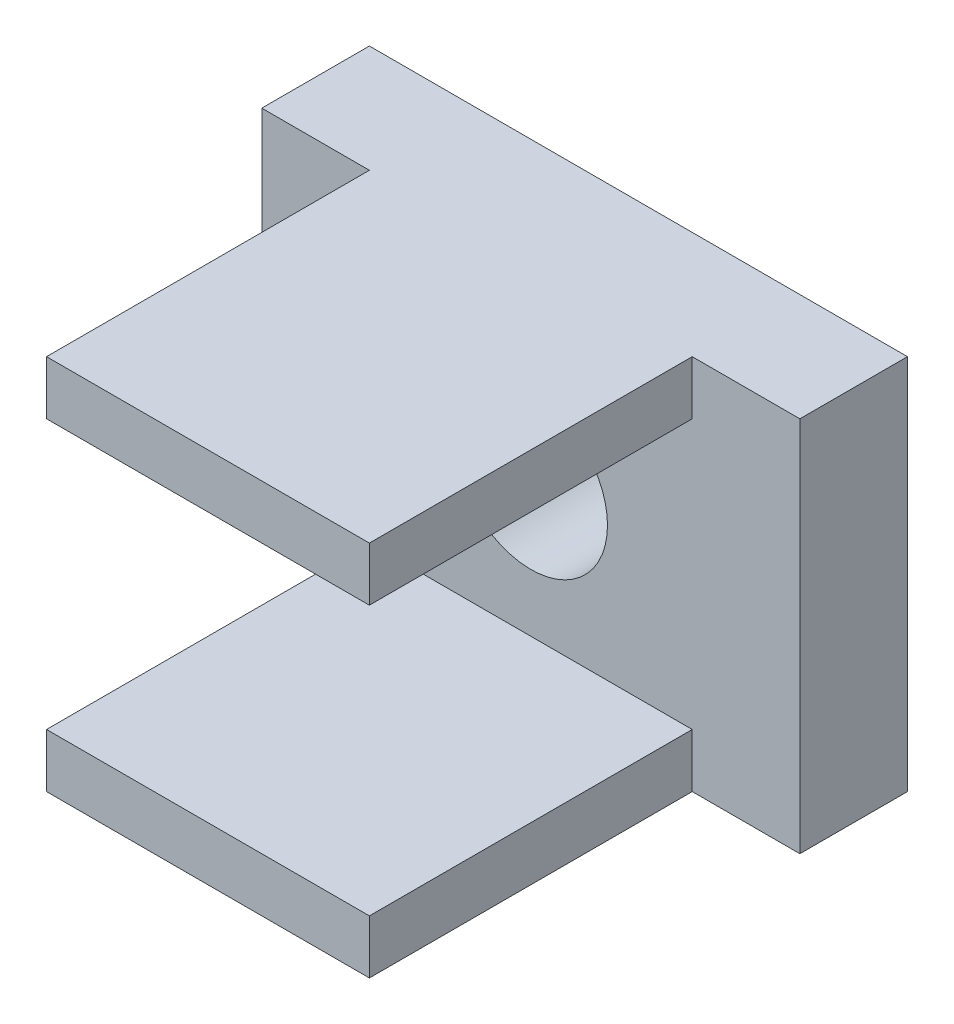
ISO-10303-21;
HEADER;
FILE_DESCRIPTION(('STEP AP214'),'2;1');
FILE_NAME('part.step','',(''),(''),'','','');
FILE_SCHEMA(('AUTOMOTIVE_DESIGN { 1 0 10303 214 1 1 1 1 }'));
ENDSEC;
DATA;
#1=APPLICATION_CONTEXT('core data for automotive mechanical design processes');
#2=APPLICATION_PROTOCOL_DEFINITION('international standard','automotive_design',2000,#1);
#3=PRODUCT_CONTEXT('',#1,'mechanical');
#4=PRODUCT('Part','Part','',(#3));
#5=PRODUCT_RELATED_PRODUCT_CATEGORY('part','',(#4));
#6=PRODUCT_DEFINITION_FORMATION('','',#4);
#7=PRODUCT_DEFINITION_CONTEXT('part definition',#1,'design');
#8=PRODUCT_DEFINITION('design','',#6,#7);
#9=PRODUCT_DEFINITION_SHAPE('','',#8);
#10=(LENGTH_UNIT() NAMED_UNIT(*) SI_UNIT(.MILLI.,.METRE.));
#11=(NAMED_UNIT(*) PLANE_ANGLE_UNIT() SI_UNIT($,.RADIAN.));
#12=(NAMED_UNIT(*) SI_UNIT($,.STERADIAN.) SOLID_ANGLE_UNIT());
#13=UNCERTAINTY_MEASURE_WITH_UNIT(LENGTH_MEASURE(1.E-05),#10,'distance_accuracy_value','');
#14=(GEOMETRIC_REPRESENTATION_CONTEXT(3) GLOBAL_UNCERTAINTY_ASSIGNED_CONTEXT((#13)) GLOBAL_UNIT_ASSIGNED_CONTEXT((#10,
#11,#12)) REPRESENTATION_CONTEXT('',''));
#15=CARTESIAN_POINT('',(0.,0.,0.));
#16=DIRECTION('',(0.,0.,1.));
#17=DIRECTION('',(1.,0.,0.));
#18=AXIS2_PLACEMENT_3D('',#15,#16,#17);
#19=CARTESIAN_POINT('',(0.,0.,1.));
#20=DIRECTION('',(0.,0.,-1.));
#21=DIRECTION('',(-1.,0.,0.));
#22=AXIS2_PLACEMENT_3D('',#19,#20,#21);
#23=PLANE('',#22);
#24=CARTESIAN_POINT('',(0.,0.,1.));
#25=DIRECTION('',(0.,0.,1.));
#26=DIRECTION('',(1.,0.,0.));
#27=AXIS2_PLACEMENT_3D('',#24,#25,#26);
#28=CIRCLE('',#27,1.425);
#29=CARTESIAN_POINT('',(1.425,0.,1.));
#30=VERTEX_POINT('',#29);
#31=EDGE_CURVE('E427',#30,#30,#28,.T.);
#32=ORIENTED_EDGE('',*,*,#31,.F.);
#33=EDGE_LOOP('',(#32));
#34=FACE_BOUND('',#33,.T.);
#35=DIRECTION('',(1.,0.,0.));
#36=VECTOR('',#35,1.);
#37=CARTESIAN_POINT('',(-3.,-2.5,1.));
#38=LINE('',#37,#36);
#39=CARTESIAN_POINT('',(-3.,-2.5,1.));
#40=VERTEX_POINT('',#39);
#41=CARTESIAN_POINT('',(3.,-2.5,1.));
#42=VERTEX_POINT('',#41);
#43=EDGE_CURVE('E55',#40,#42,#38,.T.);
#44=ORIENTED_EDGE('',*,*,#43,.T.);
#45=DIRECTION('',(0.,-1.,0.));
#46=VECTOR('',#45,1.);
#47=CARTESIAN_POINT('',(3.,-2.5,1.));
#48=LINE('',#47,#46);
#49=CARTESIAN_POINT('',(3.,-3.5,1.));
#50=VERTEX_POINT('',#49);
#51=EDGE_CURVE('E135',#42,#50,#48,.T.);
#52=ORIENTED_EDGE('',*,*,#51,.T.);
#53=DIRECTION('',(1.,0.,0.));
#54=VECTOR('',#53,1.);
#55=CARTESIAN_POINT('',(-5.,-3.5,1.));
#56=LINE('',#55,#54);
#57=CARTESIAN_POINT('',(5.,-3.5,1.));
#58=VERTEX_POINT('',#57);
#59=EDGE_CURVE('E231',#50,#58,#56,.T.);
#60=ORIENTED_EDGE('',*,*,#59,.T.);
#61=DIRECTION('',(0.,1.,0.));
#62=VECTOR('',#61,1.);
#63=CARTESIAN_POINT('',(5.,-3.5,1.));
#64=LINE('',#63,#62);
#65=CARTESIAN_POINT('',(5.,3.5,1.));
#66=VERTEX_POINT('',#65);
#67=EDGE_CURVE('E219',#58,#66,#64,.T.);
#68=ORIENTED_EDGE('',*,*,#67,.T.);
#69=DIRECTION('',(-1.,0.,0.));
#70=VECTOR('',#69,1.);
#71=CARTESIAN_POINT('',(-5.,3.5,1.));
#72=LINE('',#71,#70);
#73=CARTESIAN_POINT('',(3.,3.5,1.));
#74=VERTEX_POINT('',#73);
#75=EDGE_CURVE('E225',#66,#74,#72,.T.);
#76=ORIENTED_EDGE('',*,*,#75,.T.);
#77=DIRECTION('',(0.,1.,0.));
#78=VECTOR('',#77,1.);
#79=CARTESIAN_POINT('',(3.,2.5,1.));
#80=LINE('',#79,#78);
#81=CARTESIAN_POINT('',(3.,2.5,1.));
#82=VERTEX_POINT('',#81);
#83=EDGE_CURVE('E139',#82,#74,#80,.T.);
#84=ORIENTED_EDGE('',*,*,#83,.F.);
#85=DIRECTION('',(1.,0.,0.));
#86=VECTOR('',#85,1.);
#87=CARTESIAN_POINT('',(-3.,2.5,1.));
#88=LINE('',#87,#86);
#89=CARTESIAN_POINT('',(-3.,2.5,1.));
#90=VERTEX_POINT('',#89);
#91=EDGE_CURVE('E183',#90,#82,#88,.T.);
#92=ORIENTED_EDGE('',*,*,#91,.F.);
#93=DIRECTION('',(0.,-1.,0.));
#94=VECTOR('',#93,1.);
#95=CARTESIAN_POINT('',(-3.,2.5,1.));
#96=LINE('',#95,#94);
#97=CARTESIAN_POINT('',(-3.,3.5,1.));
#98=VERTEX_POINT('',#97);
#99=EDGE_CURVE('E196',#98,#90,#96,.T.);
#100=ORIENTED_EDGE('',*,*,#99,.F.);
#101=CARTESIAN_POINT('',(-5.,3.5,1.));
#102=VERTEX_POINT('',#101);
#103=EDGE_CURVE('E223',#98,#102,#72,.T.);
#104=ORIENTED_EDGE('',*,*,#103,.T.);
#105=DIRECTION('',(0.,-1.,0.));
#106=VECTOR('',#105,1.);
#107=CARTESIAN_POINT('',(-5.,-3.5,1.));
#108=LINE('',#107,#106);
#109=CARTESIAN_POINT('',(-5.,-3.5,1.));
#110=VERTEX_POINT('',#109);
#111=EDGE_CURVE('E228',#102,#110,#108,.T.);
#112=ORIENTED_EDGE('',*,*,#111,.T.);
#113=CARTESIAN_POINT('',(-3.,-3.5,1.));
#114=VERTEX_POINT('',#113);
#115=EDGE_CURVE('E232',#110,#114,#56,.T.);
#116=ORIENTED_EDGE('',*,*,#115,.T.);
#117=DIRECTION('',(0.,1.,0.));
#118=VECTOR('',#117,1.);
#119=CARTESIAN_POINT('',(-3.,-2.5,1.));
#120=LINE('',#119,#118);
#121=EDGE_CURVE('E60',#114,#40,#120,.T.);
#122=ORIENTED_EDGE('',*,*,#121,.T.);
#123=EDGE_LOOP('',(#44,#52,#60,#68,#76,#84,#92,#100,#104,#112,#116,#122));
#124=FACE_BOUND('',#123,.T.);
#125=ADVANCED_FACE('F39',(#34,#124),#23,.F.);
#126=CARTESIAN_POINT('',(5.,-3.5,1.));
#127=DIRECTION('',(-1.,0.,0.));
#128=DIRECTION('',(0.,0.,1.));
#129=AXIS2_PLACEMENT_3D('',#126,#127,#128);
#130=PLANE('',#129);
#131=DIRECTION('',(0.,1.,0.));
#132=VECTOR('',#131,1.);
#133=CARTESIAN_POINT('',(5.,-3.5,-1.));
#134=LINE('',#133,#132);
#135=CARTESIAN_POINT('',(5.,-3.5,-1.));
#136=VERTEX_POINT('',#135);
#137=CARTESIAN_POINT('',(5.,3.5,-1.));
#138=VERTEX_POINT('',#137);
#139=EDGE_CURVE('E218',#136,#138,#134,.T.);
#140=ORIENTED_EDGE('',*,*,#139,.T.);
#141=DIRECTION('',(0.,0.,-1.));
#142=VECTOR('',#141,1.);
#143=CARTESIAN_POINT('',(5.,3.5,1.));
#144=LINE('',#143,#142);
#145=EDGE_CURVE('E11',#66,#138,#144,.T.);
#146=ORIENTED_EDGE('',*,*,#145,.F.);
#147=ORIENTED_EDGE('',*,*,#67,.F.);
#148=DIRECTION('',(0.,0.,-1.));
#149=VECTOR('',#148,1.);
#150=CARTESIAN_POINT('',(5.,-3.5,1.));
#151=LINE('',#150,#149);
#152=EDGE_CURVE('E235',#58,#136,#151,.T.);
#153=ORIENTED_EDGE('',*,*,#152,.T.);
#154=EDGE_LOOP('',(#140,#146,#147,#153));
#155=FACE_BOUND('',#154,.T.);
#156=ADVANCED_FACE('F41',(#155),#130,.F.);
#157=CARTESIAN_POINT('',(-5.,3.5,1.));
#158=DIRECTION('',(0.,-1.,0.));
#159=DIRECTION('',(0.,0.,-1.));
#160=AXIS2_PLACEMENT_3D('',#157,#158,#159);
#161=PLANE('',#160);
#162=DIRECTION('',(-1.,0.,0.));
#163=VECTOR('',#162,1.);
#164=CARTESIAN_POINT('',(-5.,3.5,-1.));
#165=LINE('',#164,#163);
#166=CARTESIAN_POINT('',(-5.,3.5,-1.));
#167=VERTEX_POINT('',#166);
#168=EDGE_CURVE('E239',#138,#167,#165,.T.);
#169=ORIENTED_EDGE('',*,*,#168,.T.);
#170=DIRECTION('',(0.,0.,-1.));
#171=VECTOR('',#170,1.);
#172=CARTESIAN_POINT('',(-5.,3.5,1.));
#173=LINE('',#172,#171);
#174=EDGE_CURVE('E48',#102,#167,#173,.T.);
#175=ORIENTED_EDGE('',*,*,#174,.F.);
#176=ORIENTED_EDGE('',*,*,#103,.F.);
#177=DIRECTION('',(0.,0.,-1.));
#178=VECTOR('',#177,1.);
#179=CARTESIAN_POINT('',(-3.,3.5,7.));
#180=LINE('',#179,#178);
#181=CARTESIAN_POINT('',(-3.,3.5,7.));
#182=VERTEX_POINT('',#181);
#183=EDGE_CURVE('E210',#182,#98,#180,.T.);
#184=ORIENTED_EDGE('',*,*,#183,.F.);
#185=DIRECTION('',(-1.,0.,0.));
#186=VECTOR('',#185,1.);
#187=CARTESIAN_POINT('',(-3.,3.5,7.));
#188=LINE('',#187,#186);
#189=CARTESIAN_POINT('',(3.,3.5,7.));
#190=VERTEX_POINT('',#189);
#191=EDGE_CURVE('E182',#190,#182,#188,.T.);
#192=ORIENTED_EDGE('',*,*,#191,.F.);
#193=DIRECTION('',(0.,0.,-1.));
#194=VECTOR('',#193,1.);
#195=CARTESIAN_POINT('',(3.,3.5,7.));
#196=LINE('',#195,#194);
#197=EDGE_CURVE('E214',#190,#74,#196,.T.);
#198=ORIENTED_EDGE('',*,*,#197,.T.);
#199=ORIENTED_EDGE('',*,*,#75,.F.);
#200=ORIENTED_EDGE('',*,*,#145,.T.);
#201=EDGE_LOOP('',(#169,#175,#176,#184,#192,#198,#199,#200));
#202=FACE_BOUND('',#201,.T.);
#203=ADVANCED_FACE('F277',(#202),#161,.F.);
#204=CARTESIAN_POINT('',(-5.,-3.5,1.));
#205=DIRECTION('',(1.,0.,0.));
#206=DIRECTION('',(0.,0.,-1.));
#207=AXIS2_PLACEMENT_3D('',#204,#205,#206);
#208=PLANE('',#207);
#209=DIRECTION('',(0.,-1.,0.));
#210=VECTOR('',#209,1.);
#211=CARTESIAN_POINT('',(-5.,-3.5,-1.));
#212=LINE('',#211,#210);
#213=CARTESIAN_POINT('',(-5.,-3.5,-1.));
#214=VERTEX_POINT('',#213);
#215=EDGE_CURVE('E242',#167,#214,#212,.T.);
#216=ORIENTED_EDGE('',*,*,#215,.T.);
#217=DIRECTION('',(0.,0.,-1.));
#218=VECTOR('',#217,1.);
#219=CARTESIAN_POINT('',(-5.,-3.5,1.));
#220=LINE('',#219,#218);
#221=EDGE_CURVE('E250',#110,#214,#220,.T.);
#222=ORIENTED_EDGE('',*,*,#221,.F.);
#223=ORIENTED_EDGE('',*,*,#111,.F.);
#224=ORIENTED_EDGE('',*,*,#174,.T.);
#225=EDGE_LOOP('',(#216,#222,#223,#224));
#226=FACE_BOUND('',#225,.T.);
#227=ADVANCED_FACE('F259',(#226),#208,.F.);
#228=CARTESIAN_POINT('',(-5.,-3.5,1.));
#229=DIRECTION('',(0.,1.,0.));
#230=DIRECTION('',(0.,0.,1.));
#231=AXIS2_PLACEMENT_3D('',#228,#229,#230);
#232=PLANE('',#231);
#233=DIRECTION('',(1.,0.,0.));
#234=VECTOR('',#233,1.);
#235=CARTESIAN_POINT('',(-5.,-3.5,-1.));
#236=LINE('',#235,#234);
#237=EDGE_CURVE('E224',#214,#136,#236,.T.);
#238=ORIENTED_EDGE('',*,*,#237,.T.);
#239=ORIENTED_EDGE('',*,*,#152,.F.);
#240=ORIENTED_EDGE('',*,*,#59,.F.);
#241=DIRECTION('',(0.,0.,-1.));
#242=VECTOR('',#241,1.);
#243=CARTESIAN_POINT('',(3.,-3.5,7.));
#244=LINE('',#243,#242);
#245=CARTESIAN_POINT('',(3.,-3.5,7.));
#246=VERTEX_POINT('',#245);
#247=EDGE_CURVE('E162',#246,#50,#244,.T.);
#248=ORIENTED_EDGE('',*,*,#247,.F.);
#249=DIRECTION('',(-1.,0.,0.));
#250=VECTOR('',#249,1.);
#251=CARTESIAN_POINT('',(-3.,-3.5,7.));
#252=LINE('',#251,#250);
#253=CARTESIAN_POINT('',(-3.,-3.5,7.));
#254=VERTEX_POINT('',#253);
#255=EDGE_CURVE('E149',#246,#254,#252,.T.);
#256=ORIENTED_EDGE('',*,*,#255,.T.);
#257=DIRECTION('',(0.,0.,-1.));
#258=VECTOR('',#257,1.);
#259=CARTESIAN_POINT('',(-3.,-3.5,7.));
#260=LINE('',#259,#258);
#261=EDGE_CURVE('E172',#254,#114,#260,.T.);
#262=ORIENTED_EDGE('',*,*,#261,.T.);
#263=ORIENTED_EDGE('',*,*,#115,.F.);
#264=ORIENTED_EDGE('',*,*,#221,.T.);
#265=EDGE_LOOP('',(#238,#239,#240,#248,#256,#262,#263,#264));
#266=FACE_BOUND('',#265,.T.);
#267=ADVANCED_FACE('F269',(#266),#232,.F.);
#268=CARTESIAN_POINT('',(0.,0.,-1.));
#269=DIRECTION('',(0.,0.,-1.));
#270=DIRECTION('',(-1.,0.,0.));
#271=AXIS2_PLACEMENT_3D('',#268,#269,#270);
#272=PLANE('',#271);
#273=CARTESIAN_POINT('',(0.,0.,-1.));
#274=DIRECTION('',(0.,0.,1.));
#275=DIRECTION('',(1.,0.,0.));
#276=AXIS2_PLACEMENT_3D('',#273,#274,#275);
#277=CIRCLE('',#276,1.425);
#278=CARTESIAN_POINT('',(1.425,0.,-1.));
#279=VERTEX_POINT('',#278);
#280=EDGE_CURVE('E165',#279,#279,#277,.T.);
#281=ORIENTED_EDGE('',*,*,#280,.T.);
#282=EDGE_LOOP('',(#281));
#283=FACE_BOUND('',#282,.T.);
#284=ORIENTED_EDGE('',*,*,#139,.F.);
#285=ORIENTED_EDGE('',*,*,#237,.F.);
#286=ORIENTED_EDGE('',*,*,#215,.F.);
#287=ORIENTED_EDGE('',*,*,#168,.F.);
#288=EDGE_LOOP('',(#284,#285,#286,#287));
#289=FACE_BOUND('',#288,.T.);
#290=ADVANCED_FACE('F266',(#283,#289),#272,.T.);
#291=CARTESIAN_POINT('',(3.,2.5,7.));
#292=DIRECTION('',(-1.,0.,0.));
#293=DIRECTION('',(0.,0.,1.));
#294=AXIS2_PLACEMENT_3D('',#291,#292,#293);
#295=PLANE('',#294);
#296=ORIENTED_EDGE('',*,*,#83,.T.);
#297=ORIENTED_EDGE('',*,*,#197,.F.);
#298=DIRECTION('',(0.,1.,0.));
#299=VECTOR('',#298,1.);
#300=CARTESIAN_POINT('',(3.,2.5,7.));
#301=LINE('',#300,#299);
#302=CARTESIAN_POINT('',(3.,2.5,7.));
#303=VERTEX_POINT('',#302);
#304=EDGE_CURVE('E178',#303,#190,#301,.T.);
#305=ORIENTED_EDGE('',*,*,#304,.F.);
#306=DIRECTION('',(0.,0.,-1.));
#307=VECTOR('',#306,1.);
#308=CARTESIAN_POINT('',(3.,2.5,7.));
#309=LINE('',#308,#307);
#310=EDGE_CURVE('E192',#303,#82,#309,.T.);
#311=ORIENTED_EDGE('',*,*,#310,.T.);
#312=EDGE_LOOP('',(#296,#297,#305,#311));
#313=FACE_BOUND('',#312,.T.);
#314=ADVANCED_FACE('F289',(#313),#295,.F.);
#315=CARTESIAN_POINT('',(-3.,2.5,7.));
#316=DIRECTION('',(1.,0.,0.));
#317=DIRECTION('',(0.,0.,-1.));
#318=AXIS2_PLACEMENT_3D('',#315,#316,#317);
#319=PLANE('',#318);
#320=ORIENTED_EDGE('',*,*,#99,.T.);
#321=DIRECTION('',(0.,0.,-1.));
#322=VECTOR('',#321,1.);
#323=CARTESIAN_POINT('',(-3.,2.5,7.));
#324=LINE('',#323,#322);
#325=CARTESIAN_POINT('',(-3.,2.5,7.));
#326=VERTEX_POINT('',#325);
#327=EDGE_CURVE('E206',#326,#90,#324,.T.);
#328=ORIENTED_EDGE('',*,*,#327,.F.);
#329=DIRECTION('',(0.,-1.,0.));
#330=VECTOR('',#329,1.);
#331=CARTESIAN_POINT('',(-3.,2.5,7.));
#332=LINE('',#331,#330);
#333=EDGE_CURVE('E186',#182,#326,#332,.T.);
#334=ORIENTED_EDGE('',*,*,#333,.F.);
#335=ORIENTED_EDGE('',*,*,#183,.T.);
#336=EDGE_LOOP('',(#320,#328,#334,#335));
#337=FACE_BOUND('',#336,.T.);
#338=ADVANCED_FACE('F280',(#337),#319,.F.);
#339=CARTESIAN_POINT('',(-3.,2.5,7.));
#340=DIRECTION('',(0.,1.,0.));
#341=DIRECTION('',(0.,0.,1.));
#342=AXIS2_PLACEMENT_3D('',#339,#340,#341);
#343=PLANE('',#342);
#344=ORIENTED_EDGE('',*,*,#91,.T.);
#345=ORIENTED_EDGE('',*,*,#310,.F.);
#346=DIRECTION('',(1.,0.,0.));
#347=VECTOR('',#346,1.);
#348=CARTESIAN_POINT('',(-3.,2.5,7.));
#349=LINE('',#348,#347);
#350=EDGE_CURVE('E189',#326,#303,#349,.T.);
#351=ORIENTED_EDGE('',*,*,#350,.F.);
#352=ORIENTED_EDGE('',*,*,#327,.T.);
#353=EDGE_LOOP('',(#344,#345,#351,#352));
#354=FACE_BOUND('',#353,.T.);
#355=ADVANCED_FACE('F291',(#354),#343,.F.);
#356=CARTESIAN_POINT('',(0.,0.,7.));
#357=DIRECTION('',(0.,0.,-1.));
#358=DIRECTION('',(-1.,0.,0.));
#359=AXIS2_PLACEMENT_3D('',#356,#357,#358);
#360=PLANE('',#359);
#361=ORIENTED_EDGE('',*,*,#304,.T.);
#362=ORIENTED_EDGE('',*,*,#191,.T.);
#363=ORIENTED_EDGE('',*,*,#333,.T.);
#364=ORIENTED_EDGE('',*,*,#350,.T.);
#365=EDGE_LOOP('',(#361,#362,#363,#364));
#366=FACE_BOUND('',#365,.T.);
#367=ADVANCED_FACE('F284',(#366),#360,.F.);
#368=CARTESIAN_POINT('',(3.,-2.5,7.));
#369=DIRECTION('',(1.,0.,0.));
#370=DIRECTION('',(0.,0.,-1.));
#371=AXIS2_PLACEMENT_3D('',#368,#369,#370);
#372=PLANE('',#371);
#373=ORIENTED_EDGE('',*,*,#51,.F.);
#374=DIRECTION('',(0.,0.,-1.));
#375=VECTOR('',#374,1.);
#376=CARTESIAN_POINT('',(3.,-2.5,7.));
#377=LINE('',#376,#375);
#378=CARTESIAN_POINT('',(3.,-2.5,7.));
#379=VERTEX_POINT('',#378);
#380=EDGE_CURVE('E129',#379,#42,#377,.T.);
#381=ORIENTED_EDGE('',*,*,#380,.F.);
#382=DIRECTION('',(0.,-1.,0.));
#383=VECTOR('',#382,1.);
#384=CARTESIAN_POINT('',(3.,-2.5,7.));
#385=LINE('',#384,#383);
#386=EDGE_CURVE('E133',#379,#246,#385,.T.);
#387=ORIENTED_EDGE('',*,*,#386,.T.);
#388=ORIENTED_EDGE('',*,*,#247,.T.);
#389=EDGE_LOOP('',(#373,#381,#387,#388));
#390=FACE_BOUND('',#389,.T.);
#391=ADVANCED_FACE('F131',(#390),#372,.T.);
#392=CARTESIAN_POINT('',(-3.,-2.5,7.));
#393=DIRECTION('',(0.,1.,0.));
#394=DIRECTION('',(0.,0.,1.));
#395=AXIS2_PLACEMENT_3D('',#392,#393,#394);
#396=PLANE('',#395);
#397=ORIENTED_EDGE('',*,*,#43,.F.);
#398=DIRECTION('',(0.,0.,-1.));
#399=VECTOR('',#398,1.);
#400=CARTESIAN_POINT('',(-3.,-2.5,7.));
#401=LINE('',#400,#399);
#402=CARTESIAN_POINT('',(-3.,-2.5,7.));
#403=VERTEX_POINT('',#402);
#404=EDGE_CURVE('E140',#403,#40,#401,.T.);
#405=ORIENTED_EDGE('',*,*,#404,.F.);
#406=DIRECTION('',(1.,0.,0.));
#407=VECTOR('',#406,1.);
#408=CARTESIAN_POINT('',(-3.,-2.5,7.));
#409=LINE('',#408,#407);
#410=EDGE_CURVE('E146',#403,#379,#409,.T.);
#411=ORIENTED_EDGE('',*,*,#410,.T.);
#412=ORIENTED_EDGE('',*,*,#380,.T.);
#413=EDGE_LOOP('',(#397,#405,#411,#412));
#414=FACE_BOUND('',#413,.T.);
#415=ADVANCED_FACE('F152',(#414),#396,.T.);
#416=CARTESIAN_POINT('',(-3.,-2.5,7.));
#417=DIRECTION('',(-1.,0.,0.));
#418=DIRECTION('',(0.,0.,1.));
#419=AXIS2_PLACEMENT_3D('',#416,#417,#418);
#420=PLANE('',#419);
#421=ORIENTED_EDGE('',*,*,#121,.F.);
#422=ORIENTED_EDGE('',*,*,#261,.F.);
#423=DIRECTION('',(0.,1.,0.));
#424=VECTOR('',#423,1.);
#425=CARTESIAN_POINT('',(-3.,-2.5,7.));
#426=LINE('',#425,#424);
#427=EDGE_CURVE('E154',#254,#403,#426,.T.);
#428=ORIENTED_EDGE('',*,*,#427,.T.);
#429=ORIENTED_EDGE('',*,*,#404,.T.);
#430=EDGE_LOOP('',(#421,#422,#428,#429));
#431=FACE_BOUND('',#430,.T.);
#432=ADVANCED_FACE('F366',(#431),#420,.T.);
#433=CARTESIAN_POINT('',(0.,0.,7.));
#434=DIRECTION('',(0.,0.,-1.));
#435=DIRECTION('',(-1.,0.,0.));
#436=AXIS2_PLACEMENT_3D('',#433,#434,#435);
#437=PLANE('',#436);
#438=ORIENTED_EDGE('',*,*,#386,.F.);
#439=ORIENTED_EDGE('',*,*,#410,.F.);
#440=ORIENTED_EDGE('',*,*,#427,.F.);
#441=ORIENTED_EDGE('',*,*,#255,.F.);
#442=EDGE_LOOP('',(#438,#439,#440,#441));
#443=FACE_BOUND('',#442,.T.);
#444=ADVANCED_FACE('F144',(#443),#437,.F.);
#445=CARTESIAN_POINT('',(0.,0.,-1.));
#446=DIRECTION('',(0.,0.,1.));
#447=DIRECTION('',(1.,0.,0.));
#448=AXIS2_PLACEMENT_3D('',#445,#446,#447);
#449=CYLINDRICAL_SURFACE('',#448,1.425);
#450=ORIENTED_EDGE('',*,*,#280,.F.);
#451=EDGE_LOOP('',(#450));
#452=FACE_BOUND('',#451,.T.);
#453=ORIENTED_EDGE('',*,*,#31,.T.);
#454=EDGE_LOOP('',(#453));
#455=FACE_BOUND('',#454,.T.);
#456=ADVANCED_FACE('F380',(#452,#455),#449,.F.);
#457=CLOSED_SHELL('',(#125,#156,#203,#227,#267,#290,#314,#338,#355,#367,#391,#415,#432,#444,#456));
#458=MANIFOLD_SOLID_BREP('B2',#457);
#459=ADVANCED_BREP_SHAPE_REPRESENTATION('',(#18,#458),#14);
#460=SHAPE_DEFINITION_REPRESENTATION(#9,#459);
ENDSEC;
END-ISO-10303-21;
